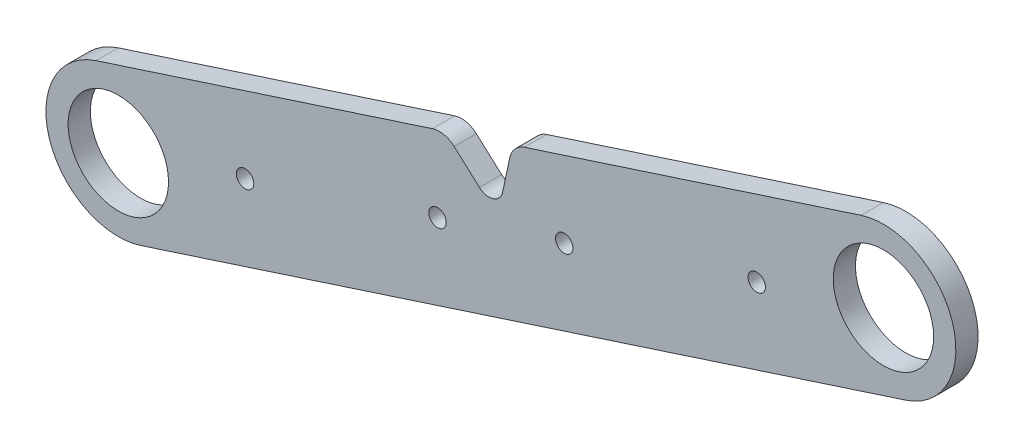
ISO-10303-21;
HEADER;
FILE_DESCRIPTION(('STEP AP214'),'2;1');
FILE_NAME('part.step','',(''),(''),'','','');
FILE_SCHEMA(('AUTOMOTIVE_DESIGN { 1 0 10303 214 1 1 1 1 }'));
ENDSEC;
DATA;
#1=APPLICATION_CONTEXT('core data for automotive mechanical design processes');
#2=APPLICATION_PROTOCOL_DEFINITION('international standard','automotive_design',2000,#1);
#3=PRODUCT_CONTEXT('',#1,'mechanical');
#4=PRODUCT('Part','Part','',(#3));
#5=PRODUCT_RELATED_PRODUCT_CATEGORY('part','',(#4));
#6=PRODUCT_DEFINITION_FORMATION('','',#4);
#7=PRODUCT_DEFINITION_CONTEXT('part definition',#1,'design');
#8=PRODUCT_DEFINITION('design','',#6,#7);
#9=PRODUCT_DEFINITION_SHAPE('','',#8);
#10=(LENGTH_UNIT() NAMED_UNIT(*) SI_UNIT(.MILLI.,.METRE.));
#11=(NAMED_UNIT(*) PLANE_ANGLE_UNIT() SI_UNIT($,.RADIAN.));
#12=(NAMED_UNIT(*) SI_UNIT($,.STERADIAN.) SOLID_ANGLE_UNIT());
#13=UNCERTAINTY_MEASURE_WITH_UNIT(LENGTH_MEASURE(1.E-05),#10,'distance_accuracy_value','');
#14=(GEOMETRIC_REPRESENTATION_CONTEXT(3) GLOBAL_UNCERTAINTY_ASSIGNED_CONTEXT((#13)) GLOBAL_UNIT_ASSIGNED_CONTEXT((#10,
#11,#12)) REPRESENTATION_CONTEXT('',''));
#15=CARTESIAN_POINT('',(0.,0.,0.));
#16=DIRECTION('',(0.,0.,1.));
#17=DIRECTION('',(1.,0.,0.));
#18=AXIS2_PLACEMENT_3D('',#15,#16,#17);
#19=CARTESIAN_POINT('',(-248.402370748276,67.7567016355575,3.175));
#20=DIRECTION('',(0.,0.,1.));
#21=DIRECTION('',(1.,0.,0.));
#22=AXIS2_PLACEMENT_3D('',#19,#20,#21);
#23=PLANE('',#22);
#24=CARTESIAN_POINT('',(-318.104446758383,33.4247503047027,3.175));
#25=DIRECTION('',(0.,0.,1.));
#26=DIRECTION('',(1.,0.,0.));
#27=AXIS2_PLACEMENT_3D('',#24,#25,#26);
#28=CIRCLE('',#27,2.48920000000001);
#29=CARTESIAN_POINT('',(-315.615246758383,33.4247503047027,3.175));
#30=VERTEX_POINT('',#29);
#31=EDGE_CURVE('E367',#30,#30,#28,.T.);
#32=ORIENTED_EDGE('',*,*,#31,.F.);
#33=EDGE_LOOP('',(#32));
#34=FACE_BOUND('',#33,.T.);
#35=CARTESIAN_POINT('',(-226.850792762861,63.0748598410703,3.175));
#36=DIRECTION('',(0.,0.,1.));
#37=DIRECTION('',(1.,0.,0.));
#38=AXIS2_PLACEMENT_3D('',#35,#36,#37);
#39=CIRCLE('',#38,2.4892);
#40=CARTESIAN_POINT('',(-224.361592762862,63.0748598410703,3.175));
#41=VERTEX_POINT('',#40);
#42=EDGE_CURVE('E375',#41,#41,#39,.T.);
#43=ORIENTED_EDGE('',*,*,#42,.F.);
#44=EDGE_LOOP('',(#43));
#45=FACE_BOUND('',#44,.T.);
#46=CARTESIAN_POINT('',(-263.086046033707,51.3013123553848,3.175));
#47=DIRECTION('',(0.,0.,1.));
#48=DIRECTION('',(1.,0.,0.));
#49=AXIS2_PLACEMENT_3D('',#46,#47,#48);
#50=CIRCLE('',#49,2.48920000000001);
#51=CARTESIAN_POINT('',(-260.596846033707,51.3013123553848,3.175));
#52=VERTEX_POINT('',#51);
#53=EDGE_CURVE('E384',#52,#52,#50,.T.);
#54=ORIENTED_EDGE('',*,*,#53,.F.);
#55=EDGE_LOOP('',(#54));
#56=FACE_BOUND('',#55,.T.);
#57=CARTESIAN_POINT('',(-171.832392038186,80.9514218917523,3.175));
#58=DIRECTION('',(0.,0.,1.));
#59=DIRECTION('',(1.,0.,0.));
#60=AXIS2_PLACEMENT_3D('',#57,#58,#59);
#61=CIRCLE('',#60,2.4892);
#62=CARTESIAN_POINT('',(-169.343192038186,80.9514218917523,3.175));
#63=VERTEX_POINT('',#62);
#64=EDGE_CURVE('E368',#63,#63,#61,.T.);
#65=ORIENTED_EDGE('',*,*,#64,.F.);
#66=EDGE_LOOP('',(#65));
#67=FACE_BOUND('',#66,.T.);
#68=CARTESIAN_POINT('',(-135.59713876734,92.7249693774379,3.175));
#69=DIRECTION('',(0.,0.,1.));
#70=DIRECTION('',(1.,0.,0.));
#71=AXIS2_PLACEMENT_3D('',#68,#69,#70);
#72=CIRCLE('',#71,14.3510000000001);
#73=CARTESIAN_POINT('',(-121.24613876734,92.7249693774379,3.175));
#74=VERTEX_POINT('',#73);
#75=EDGE_CURVE('E217',#74,#74,#72,.T.);
#76=ORIENTED_EDGE('',*,*,#75,.F.);
#77=EDGE_LOOP('',(#76));
#78=FACE_BOUND('',#77,.T.);
#79=DIRECTION('',(-0.951056516295153,-0.309016994374948,0.));
#80=VECTOR('',#79,1.);
#81=CARTESIAN_POINT('',(-241.679219613314,80.0231313971656,3.175));
#82=LINE('',#81,#80);
#83=CARTESIAN_POINT('',(-141.994099567896,112.412790321264,3.175));
#84=VERTEX_POINT('',#83);
#85=CARTESIAN_POINT('',(-238.192480741635,81.1560415321952,3.175));
#86=VERTEX_POINT('',#85);
#87=EDGE_CURVE('E210',#84,#86,#82,.T.);
#88=ORIENTED_EDGE('',*,*,#87,.T.);
#89=CARTESIAN_POINT('',(-236.230222827354,75.1168326537209,3.175));
#90=DIRECTION('',(0.,0.,1.));
#91=DIRECTION('',(1.,0.,0.));
#92=AXIS2_PLACEMENT_3D('',#89,#90,#91);
#93=CIRCLE('',#92,6.35);
#94=CARTESIAN_POINT('',(-242.441460092014,76.4370718904137,3.175));
#95=VERTEX_POINT('',#94);
#96=EDGE_CURVE('E154',#86,#95,#93,.T.);
#97=ORIENTED_EDGE('',*,*,#96,.T.);
#98=DIRECTION('',(-0.207911690817758,-0.978147600733806,0.));
#99=VECTOR('',#98,1.);
#100=CARTESIAN_POINT('',(-244.464446322482,66.9196699594943,3.175));
#101=LINE('',#100,#99);
#102=CARTESIAN_POINT('',(-244.464446322482,66.9196699594943,3.175));
#103=VERTEX_POINT('',#102);
#104=EDGE_CURVE('E128',#95,#103,#101,.T.);
#105=ORIENTED_EDGE('',*,*,#104,.T.);
#106=CARTESIAN_POINT('',(-248.402370748276,67.7567016355575,3.175));
#107=DIRECTION('',(0.,0.,-1.));
#108=DIRECTION('',(1.,0.,0.));
#109=AXIS2_PLACEMENT_3D('',#106,#107,#108);
#110=CIRCLE('',#109,4.02589999999997);
#111=CARTESIAN_POINT('',(-251.096223656416,64.7648748826681,3.175));
#112=VERTEX_POINT('',#111);
#113=EDGE_CURVE('E122',#103,#112,#110,.T.);
#114=ORIENTED_EDGE('',*,*,#113,.T.);
#115=DIRECTION('',(-0.743144825477399,0.669130606358853,0.));
#116=VECTOR('',#115,1.);
#117=CARTESIAN_POINT('',(-251.096223656416,64.7648748826681,3.175));
#118=LINE('',#117,#116);
#119=CARTESIAN_POINT('',(-258.327042391385,71.2755333152191,3.175));
#120=VERTEX_POINT('',#119);
#121=EDGE_CURVE('E115',#112,#120,#118,.T.);
#122=ORIENTED_EDGE('',*,*,#121,.T.);
#123=CARTESIAN_POINT('',(-262.576021741764,66.5565636734376,3.175));
#124=DIRECTION('',(0.,0.,1.));
#125=DIRECTION('',(1.,0.,0.));
#126=AXIS2_PLACEMENT_3D('',#123,#124,#125);
#127=CIRCLE('',#126,6.35);
#128=CARTESIAN_POINT('',(-264.538279656045,72.5957725519118,3.175));
#129=VERTEX_POINT('',#128);
#130=EDGE_CURVE('E56',#120,#129,#127,.T.);
#131=ORIENTED_EDGE('',*,*,#130,.T.);
#132=DIRECTION('',(-0.951056516295153,-0.309016994374948,0.));
#133=VECTOR('',#132,1.);
#134=CARTESIAN_POINT('',(-360.736660829784,41.3390237628432,3.175));
#135=LINE('',#134,#133);
#136=CARTESIAN_POINT('',(-360.736660829784,41.3390237628432,3.175));
#137=VERTEX_POINT('',#136);
#138=EDGE_CURVE('E121',#129,#137,#135,.T.);
#139=ORIENTED_EDGE('',*,*,#138,.T.);
#140=CARTESIAN_POINT('',(-354.339700029228,21.6512028190172,3.175));
#141=DIRECTION('',(0.,0.,1.));
#142=DIRECTION('',(1.,0.,0.));
#143=AXIS2_PLACEMENT_3D('',#140,#141,#142);
#144=CIRCLE('',#143,20.701);
#145=CARTESIAN_POINT('',(-347.942739228672,1.96338187519125,3.175));
#146=VERTEX_POINT('',#145);
#147=EDGE_CURVE('E231',#137,#146,#144,.T.);
#148=ORIENTED_EDGE('',*,*,#147,.T.);
#149=DIRECTION('',(0.951056516295153,0.309016994374948,0.));
#150=VECTOR('',#149,1.);
#151=CARTESIAN_POINT('',(-347.942739228672,1.96338187519125,3.175));
#152=LINE('',#151,#150);
#153=CARTESIAN_POINT('',(-129.200177966785,73.0371484336119,3.175));
#154=VERTEX_POINT('',#153);
#155=EDGE_CURVE('E197',#146,#154,#152,.T.);
#156=ORIENTED_EDGE('',*,*,#155,.T.);
#157=CARTESIAN_POINT('',(-135.59713876734,92.7249693774379,3.175));
#158=DIRECTION('',(0.,0.,1.));
#159=DIRECTION('',(1.,0.,0.));
#160=AXIS2_PLACEMENT_3D('',#157,#158,#159);
#161=CIRCLE('',#160,20.701);
#162=EDGE_CURVE('E212',#154,#84,#161,.T.);
#163=ORIENTED_EDGE('',*,*,#162,.T.);
#164=EDGE_LOOP('',(#88,#97,#105,#114,#122,#131,#139,#148,#156,#163));
#165=FACE_BOUND('',#164,.T.);
#166=CARTESIAN_POINT('',(-354.339700029228,21.6512028190172,3.175));
#167=DIRECTION('',(0.,0.,1.));
#168=DIRECTION('',(1.,0.,0.));
#169=AXIS2_PLACEMENT_3D('',#166,#167,#168);
#170=CIRCLE('',#169,14.3510000000001);
#171=CARTESIAN_POINT('',(-339.988700029228,21.6512028190172,3.175));
#172=VERTEX_POINT('',#171);
#173=EDGE_CURVE('E224',#172,#172,#170,.T.);
#174=ORIENTED_EDGE('',*,*,#173,.F.);
#175=EDGE_LOOP('',(#174));
#176=FACE_BOUND('',#175,.T.);
#177=ADVANCED_FACE('F41',(#34,#45,#56,#67,#78,#165,#176),#23,.T.);
#178=CARTESIAN_POINT('',(-248.402370748276,67.7567016355575,-3.175));
#179=DIRECTION('',(0.,0.,1.));
#180=DIRECTION('',(1.,0.,0.));
#181=AXIS2_PLACEMENT_3D('',#178,#179,#180);
#182=PLANE('',#181);
#183=CARTESIAN_POINT('',(-318.104446758383,33.4247503047027,-3.175));
#184=DIRECTION('',(0.,0.,1.));
#185=DIRECTION('',(1.,0.,0.));
#186=AXIS2_PLACEMENT_3D('',#183,#184,#185);
#187=CIRCLE('',#186,2.48920000000001);
#188=CARTESIAN_POINT('',(-315.615246758383,33.4247503047027,-3.175));
#189=VERTEX_POINT('',#188);
#190=EDGE_CURVE('E365',#189,#189,#187,.T.);
#191=ORIENTED_EDGE('',*,*,#190,.T.);
#192=EDGE_LOOP('',(#191));
#193=FACE_BOUND('',#192,.T.);
#194=CARTESIAN_POINT('',(-226.850792762861,63.0748598410703,-3.175));
#195=DIRECTION('',(0.,0.,1.));
#196=DIRECTION('',(1.,0.,0.));
#197=AXIS2_PLACEMENT_3D('',#194,#195,#196);
#198=CIRCLE('',#197,2.4892);
#199=CARTESIAN_POINT('',(-224.361592762862,63.0748598410703,-3.175));
#200=VERTEX_POINT('',#199);
#201=EDGE_CURVE('E379',#200,#200,#198,.T.);
#202=ORIENTED_EDGE('',*,*,#201,.T.);
#203=EDGE_LOOP('',(#202));
#204=FACE_BOUND('',#203,.T.);
#205=CARTESIAN_POINT('',(-263.086046033707,51.3013123553848,-3.175));
#206=DIRECTION('',(0.,0.,1.));
#207=DIRECTION('',(1.,0.,0.));
#208=AXIS2_PLACEMENT_3D('',#205,#206,#207);
#209=CIRCLE('',#208,2.48920000000001);
#210=CARTESIAN_POINT('',(-260.596846033707,51.3013123553848,-3.175));
#211=VERTEX_POINT('',#210);
#212=EDGE_CURVE('E378',#211,#211,#209,.T.);
#213=ORIENTED_EDGE('',*,*,#212,.T.);
#214=EDGE_LOOP('',(#213));
#215=FACE_BOUND('',#214,.T.);
#216=CARTESIAN_POINT('',(-171.832392038186,80.9514218917523,-3.175));
#217=DIRECTION('',(0.,0.,1.));
#218=DIRECTION('',(1.,0.,0.));
#219=AXIS2_PLACEMENT_3D('',#216,#217,#218);
#220=CIRCLE('',#219,2.4892);
#221=CARTESIAN_POINT('',(-169.343192038186,80.9514218917523,-3.175));
#222=VERTEX_POINT('',#221);
#223=EDGE_CURVE('E372',#222,#222,#220,.T.);
#224=ORIENTED_EDGE('',*,*,#223,.T.);
#225=EDGE_LOOP('',(#224));
#226=FACE_BOUND('',#225,.T.);
#227=DIRECTION('',(-0.207911690817758,-0.978147600733806,0.));
#228=VECTOR('',#227,1.);
#229=CARTESIAN_POINT('',(-244.464446322482,66.9196699594943,-3.175));
#230=LINE('',#229,#228);
#231=CARTESIAN_POINT('',(-242.441460092014,76.4370718904137,-3.175));
#232=VERTEX_POINT('',#231);
#233=CARTESIAN_POINT('',(-244.464446322482,66.9196699594943,-3.175));
#234=VERTEX_POINT('',#233);
#235=EDGE_CURVE('E132',#232,#234,#230,.T.);
#236=ORIENTED_EDGE('',*,*,#235,.F.);
#237=CARTESIAN_POINT('',(-236.230222827354,75.1168326537209,-3.175));
#238=DIRECTION('',(0.,0.,1.));
#239=DIRECTION('',(1.,0.,0.));
#240=AXIS2_PLACEMENT_3D('',#237,#238,#239);
#241=CIRCLE('',#240,6.35);
#242=CARTESIAN_POINT('',(-238.192480741635,81.1560415321952,-3.175));
#243=VERTEX_POINT('',#242);
#244=EDGE_CURVE('E149',#232,#243,#241,.F.);
#245=ORIENTED_EDGE('',*,*,#244,.T.);
#246=DIRECTION('',(-0.951056516295153,-0.309016994374948,0.));
#247=VECTOR('',#246,1.);
#248=CARTESIAN_POINT('',(-241.679219613314,80.0231313971656,-3.175));
#249=LINE('',#248,#247);
#250=CARTESIAN_POINT('',(-141.994099567896,112.412790321264,-3.175));
#251=VERTEX_POINT('',#250);
#252=EDGE_CURVE('E180',#251,#243,#249,.T.);
#253=ORIENTED_EDGE('',*,*,#252,.F.);
#254=CARTESIAN_POINT('',(-135.59713876734,92.7249693774379,-3.175));
#255=DIRECTION('',(0.,0.,1.));
#256=DIRECTION('',(1.,0.,0.));
#257=AXIS2_PLACEMENT_3D('',#254,#255,#256);
#258=CIRCLE('',#257,20.701);
#259=CARTESIAN_POINT('',(-129.200177966785,73.0371484336119,-3.175));
#260=VERTEX_POINT('',#259);
#261=EDGE_CURVE('E178',#260,#251,#258,.T.);
#262=ORIENTED_EDGE('',*,*,#261,.F.);
#263=DIRECTION('',(0.951056516295153,0.309016994374948,0.));
#264=VECTOR('',#263,1.);
#265=CARTESIAN_POINT('',(-347.942739228672,1.96338187519125,-3.175));
#266=LINE('',#265,#264);
#267=CARTESIAN_POINT('',(-347.942739228672,1.96338187519125,-3.175));
#268=VERTEX_POINT('',#267);
#269=EDGE_CURVE('E172',#268,#260,#266,.T.);
#270=ORIENTED_EDGE('',*,*,#269,.F.);
#271=CARTESIAN_POINT('',(-354.339700029228,21.6512028190172,-3.175));
#272=DIRECTION('',(0.,0.,1.));
#273=DIRECTION('',(1.,0.,0.));
#274=AXIS2_PLACEMENT_3D('',#271,#272,#273);
#275=CIRCLE('',#274,20.701);
#276=CARTESIAN_POINT('',(-360.736660829784,41.3390237628432,-3.175));
#277=VERTEX_POINT('',#276);
#278=EDGE_CURVE('E169',#277,#268,#275,.T.);
#279=ORIENTED_EDGE('',*,*,#278,.F.);
#280=DIRECTION('',(-0.951056516295153,-0.309016994374948,0.));
#281=VECTOR('',#280,1.);
#282=CARTESIAN_POINT('',(-360.736660829784,41.3390237628432,-3.175));
#283=LINE('',#282,#281);
#284=CARTESIAN_POINT('',(-264.538279656045,72.5957725519118,-3.175));
#285=VERTEX_POINT('',#284);
#286=EDGE_CURVE('E161',#285,#277,#283,.T.);
#287=ORIENTED_EDGE('',*,*,#286,.F.);
#288=CARTESIAN_POINT('',(-262.576021741764,66.5565636734376,-3.175));
#289=DIRECTION('',(0.,0.,1.));
#290=DIRECTION('',(1.,0.,0.));
#291=AXIS2_PLACEMENT_3D('',#288,#289,#290);
#292=CIRCLE('',#291,6.35);
#293=CARTESIAN_POINT('',(-258.327042391385,71.2755333152191,-3.175));
#294=VERTEX_POINT('',#293);
#295=EDGE_CURVE('E141',#285,#294,#292,.F.);
#296=ORIENTED_EDGE('',*,*,#295,.T.);
#297=DIRECTION('',(-0.743144825477399,0.669130606358853,0.));
#298=VECTOR('',#297,1.);
#299=CARTESIAN_POINT('',(-251.096223656416,64.7648748826681,-3.175));
#300=LINE('',#299,#298);
#301=CARTESIAN_POINT('',(-251.096223656416,64.7648748826681,-3.175));
#302=VERTEX_POINT('',#301);
#303=EDGE_CURVE('E170',#302,#294,#300,.T.);
#304=ORIENTED_EDGE('',*,*,#303,.F.);
#305=CARTESIAN_POINT('',(-248.402370748276,67.7567016355575,-3.175));
#306=DIRECTION('',(0.,0.,-1.));
#307=DIRECTION('',(1.,0.,0.));
#308=AXIS2_PLACEMENT_3D('',#305,#306,#307);
#309=CIRCLE('',#308,4.02589999999997);
#310=EDGE_CURVE('E136',#234,#302,#309,.T.);
#311=ORIENTED_EDGE('',*,*,#310,.F.);
#312=EDGE_LOOP('',(#236,#245,#253,#262,#270,#279,#287,#296,#304,#311));
#313=FACE_BOUND('',#312,.T.);
#314=CARTESIAN_POINT('',(-135.59713876734,92.7249693774379,-3.175));
#315=DIRECTION('',(0.,0.,1.));
#316=DIRECTION('',(1.,0.,0.));
#317=AXIS2_PLACEMENT_3D('',#314,#315,#316);
#318=CIRCLE('',#317,14.3510000000001);
#319=CARTESIAN_POINT('',(-121.24613876734,92.7249693774379,-3.175));
#320=VERTEX_POINT('',#319);
#321=EDGE_CURVE('E219',#320,#320,#318,.T.);
#322=ORIENTED_EDGE('',*,*,#321,.T.);
#323=EDGE_LOOP('',(#322));
#324=FACE_BOUND('',#323,.T.);
#325=CARTESIAN_POINT('',(-354.339700029228,21.6512028190172,-3.175));
#326=DIRECTION('',(0.,0.,1.));
#327=DIRECTION('',(1.,0.,0.));
#328=AXIS2_PLACEMENT_3D('',#325,#326,#327);
#329=CIRCLE('',#328,14.3510000000001);
#330=CARTESIAN_POINT('',(-339.988700029228,21.6512028190172,-3.175));
#331=VERTEX_POINT('',#330);
#332=EDGE_CURVE('E227',#331,#331,#329,.T.);
#333=ORIENTED_EDGE('',*,*,#332,.T.);
#334=EDGE_LOOP('',(#333));
#335=FACE_BOUND('',#334,.T.);
#336=ADVANCED_FACE('F166',(#193,#204,#215,#226,#313,#324,#335),#182,.F.);
#337=CARTESIAN_POINT('',(-248.402370748276,67.7567016355575,3.175));
#338=DIRECTION('',(0.,0.,-1.));
#339=DIRECTION('',(-1.,0.,0.));
#340=AXIS2_PLACEMENT_3D('',#337,#338,#339);
#341=CYLINDRICAL_SURFACE('',#340,4.02589999999997);
#342=ORIENTED_EDGE('',*,*,#310,.T.);
#343=DIRECTION('',(0.,0.,-1.));
#344=VECTOR('',#343,1.);
#345=CARTESIAN_POINT('',(-251.096223656416,64.7648748826681,3.175));
#346=LINE('',#345,#344);
#347=EDGE_CURVE('E119',#112,#302,#346,.T.);
#348=ORIENTED_EDGE('',*,*,#347,.F.);
#349=ORIENTED_EDGE('',*,*,#113,.F.);
#350=DIRECTION('',(0.,0.,-1.));
#351=VECTOR('',#350,1.);
#352=CARTESIAN_POINT('',(-244.464446322482,66.9196699594943,3.175));
#353=LINE('',#352,#351);
#354=EDGE_CURVE('E184',#103,#234,#353,.T.);
#355=ORIENTED_EDGE('',*,*,#354,.T.);
#356=EDGE_LOOP('',(#342,#348,#349,#355));
#357=FACE_BOUND('',#356,.T.);
#358=ADVANCED_FACE('F134',(#357),#341,.F.);
#359=CARTESIAN_POINT('',(-251.096223656416,64.7648748826681,3.175));
#360=DIRECTION('',(-0.669130606358853,-0.743144825477399,0.));
#361=DIRECTION('',(0.743144825477399,-0.669130606358853,0.));
#362=AXIS2_PLACEMENT_3D('',#359,#360,#361);
#363=PLANE('',#362);
#364=ORIENTED_EDGE('',*,*,#303,.T.);
#365=DIRECTION('',(0.,0.,-1.));
#366=VECTOR('',#365,1.);
#367=CARTESIAN_POINT('',(-258.327042391385,71.2755333152191,3.175));
#368=LINE('',#367,#366);
#369=EDGE_CURVE('E11',#294,#120,#368,.F.);
#370=ORIENTED_EDGE('',*,*,#369,.T.);
#371=ORIENTED_EDGE('',*,*,#121,.F.);
#372=ORIENTED_EDGE('',*,*,#347,.T.);
#373=EDGE_LOOP('',(#364,#370,#371,#372));
#374=FACE_BOUND('',#373,.T.);
#375=ADVANCED_FACE('F117',(#374),#363,.F.);
#376=CARTESIAN_POINT('',(-360.736660829784,41.3390237628432,3.175));
#377=DIRECTION('',(0.309016994374948,-0.951056516295153,0.));
#378=DIRECTION('',(0.951056516295153,0.309016994374948,0.));
#379=AXIS2_PLACEMENT_3D('',#376,#377,#378);
#380=PLANE('',#379);
#381=ORIENTED_EDGE('',*,*,#138,.F.);
#382=DIRECTION('',(0.,0.,-1.));
#383=VECTOR('',#382,1.);
#384=CARTESIAN_POINT('',(-264.538279656045,72.5957725519118,3.175));
#385=LINE('',#384,#383);
#386=EDGE_CURVE('E49',#129,#285,#385,.T.);
#387=ORIENTED_EDGE('',*,*,#386,.T.);
#388=ORIENTED_EDGE('',*,*,#286,.T.);
#389=DIRECTION('',(0.,0.,-1.));
#390=VECTOR('',#389,1.);
#391=CARTESIAN_POINT('',(-360.736660829784,41.3390237628432,3.175));
#392=LINE('',#391,#390);
#393=EDGE_CURVE('E138',#137,#277,#392,.T.);
#394=ORIENTED_EDGE('',*,*,#393,.F.);
#395=EDGE_LOOP('',(#381,#387,#388,#394));
#396=FACE_BOUND('',#395,.T.);
#397=ADVANCED_FACE('F159',(#396),#380,.F.);
#398=CARTESIAN_POINT('',(-354.339700029228,21.6512028190172,3.175));
#399=DIRECTION('',(0.,0.,-1.));
#400=DIRECTION('',(-1.,0.,0.));
#401=AXIS2_PLACEMENT_3D('',#398,#399,#400);
#402=CYLINDRICAL_SURFACE('',#401,20.701);
#403=ORIENTED_EDGE('',*,*,#278,.T.);
#404=DIRECTION('',(0.,0.,-1.));
#405=VECTOR('',#404,1.);
#406=CARTESIAN_POINT('',(-347.942739228672,1.96338187519125,3.175));
#407=LINE('',#406,#405);
#408=EDGE_CURVE('E144',#146,#268,#407,.T.);
#409=ORIENTED_EDGE('',*,*,#408,.F.);
#410=ORIENTED_EDGE('',*,*,#147,.F.);
#411=ORIENTED_EDGE('',*,*,#393,.T.);
#412=EDGE_LOOP('',(#403,#409,#410,#411));
#413=FACE_BOUND('',#412,.T.);
#414=ADVANCED_FACE('F232',(#413),#402,.T.);
#415=CARTESIAN_POINT('',(-347.942739228672,1.96338187519125,3.175));
#416=DIRECTION('',(-0.309016994374948,0.951056516295153,0.));
#417=DIRECTION('',(-0.951056516295153,-0.309016994374948,0.));
#418=AXIS2_PLACEMENT_3D('',#415,#416,#417);
#419=PLANE('',#418);
#420=ORIENTED_EDGE('',*,*,#269,.T.);
#421=DIRECTION('',(0.,0.,-1.));
#422=VECTOR('',#421,1.);
#423=CARTESIAN_POINT('',(-129.200177966785,73.0371484336119,3.175));
#424=LINE('',#423,#422);
#425=EDGE_CURVE('E189',#154,#260,#424,.T.);
#426=ORIENTED_EDGE('',*,*,#425,.F.);
#427=ORIENTED_EDGE('',*,*,#155,.F.);
#428=ORIENTED_EDGE('',*,*,#408,.T.);
#429=EDGE_LOOP('',(#420,#426,#427,#428));
#430=FACE_BOUND('',#429,.T.);
#431=ADVANCED_FACE('F195',(#430),#419,.F.);
#432=CARTESIAN_POINT('',(-135.59713876734,92.7249693774379,3.175));
#433=DIRECTION('',(0.,0.,-1.));
#434=DIRECTION('',(-1.,0.,0.));
#435=AXIS2_PLACEMENT_3D('',#432,#433,#434);
#436=CYLINDRICAL_SURFACE('',#435,20.701);
#437=ORIENTED_EDGE('',*,*,#261,.T.);
#438=DIRECTION('',(0.,0.,-1.));
#439=VECTOR('',#438,1.);
#440=CARTESIAN_POINT('',(-141.994099567896,112.412790321264,3.175));
#441=LINE('',#440,#439);
#442=EDGE_CURVE('E186',#84,#251,#441,.T.);
#443=ORIENTED_EDGE('',*,*,#442,.F.);
#444=ORIENTED_EDGE('',*,*,#162,.F.);
#445=ORIENTED_EDGE('',*,*,#425,.T.);
#446=EDGE_LOOP('',(#437,#443,#444,#445));
#447=FACE_BOUND('',#446,.T.);
#448=ADVANCED_FACE('F204',(#447),#436,.T.);
#449=CARTESIAN_POINT('',(-241.679219613314,80.0231313971656,3.175));
#450=DIRECTION('',(0.309016994374948,-0.951056516295153,0.));
#451=DIRECTION('',(0.951056516295153,0.309016994374948,0.));
#452=AXIS2_PLACEMENT_3D('',#449,#450,#451);
#453=PLANE('',#452);
#454=ORIENTED_EDGE('',*,*,#252,.T.);
#455=DIRECTION('',(0.,0.,-1.));
#456=VECTOR('',#455,1.);
#457=CARTESIAN_POINT('',(-238.192480741635,81.1560415321952,3.175));
#458=LINE('',#457,#456);
#459=EDGE_CURVE('E151',#243,#86,#458,.F.);
#460=ORIENTED_EDGE('',*,*,#459,.T.);
#461=ORIENTED_EDGE('',*,*,#87,.F.);
#462=ORIENTED_EDGE('',*,*,#442,.T.);
#463=EDGE_LOOP('',(#454,#460,#461,#462));
#464=FACE_BOUND('',#463,.T.);
#465=ADVANCED_FACE('F208',(#464),#453,.F.);
#466=CARTESIAN_POINT('',(-244.464446322482,66.9196699594943,3.175));
#467=DIRECTION('',(0.978147600733806,-0.207911690817758,0.));
#468=DIRECTION('',(0.207911690817758,0.978147600733806,0.));
#469=AXIS2_PLACEMENT_3D('',#466,#467,#468);
#470=PLANE('',#469);
#471=ORIENTED_EDGE('',*,*,#104,.F.);
#472=DIRECTION('',(0.,0.,-1.));
#473=VECTOR('',#472,1.);
#474=CARTESIAN_POINT('',(-242.441460092014,76.4370718904137,3.175));
#475=LINE('',#474,#473);
#476=EDGE_CURVE('E137',#95,#232,#475,.T.);
#477=ORIENTED_EDGE('',*,*,#476,.T.);
#478=ORIENTED_EDGE('',*,*,#235,.T.);
#479=ORIENTED_EDGE('',*,*,#354,.F.);
#480=EDGE_LOOP('',(#471,#477,#478,#479));
#481=FACE_BOUND('',#480,.T.);
#482=ADVANCED_FACE('F257',(#481),#470,.F.);
#483=CARTESIAN_POINT('',(-135.59713876734,92.7249693774379,3.175));
#484=DIRECTION('',(0.,0.,-1.));
#485=DIRECTION('',(-1.,0.,0.));
#486=AXIS2_PLACEMENT_3D('',#483,#484,#485);
#487=CYLINDRICAL_SURFACE('',#486,14.3510000000001);
#488=ORIENTED_EDGE('',*,*,#75,.T.);
#489=EDGE_LOOP('',(#488));
#490=FACE_BOUND('',#489,.T.);
#491=ORIENTED_EDGE('',*,*,#321,.F.);
#492=EDGE_LOOP('',(#491));
#493=FACE_BOUND('',#492,.T.);
#494=ADVANCED_FACE('F254',(#490,#493),#487,.F.);
#495=CARTESIAN_POINT('',(-354.339700029228,21.6512028190172,3.175));
#496=DIRECTION('',(0.,0.,-1.));
#497=DIRECTION('',(-1.,0.,0.));
#498=AXIS2_PLACEMENT_3D('',#495,#496,#497);
#499=CYLINDRICAL_SURFACE('',#498,14.3510000000001);
#500=ORIENTED_EDGE('',*,*,#173,.T.);
#501=EDGE_LOOP('',(#500));
#502=FACE_BOUND('',#501,.T.);
#503=ORIENTED_EDGE('',*,*,#332,.F.);
#504=EDGE_LOOP('',(#503));
#505=FACE_BOUND('',#504,.T.);
#506=ADVANCED_FACE('F276',(#502,#505),#499,.F.);
#507=CARTESIAN_POINT('',(-236.230222827354,75.1168326537209,3.175));
#508=DIRECTION('',(0.,0.,-1.));
#509=DIRECTION('',(-1.,0.,0.));
#510=AXIS2_PLACEMENT_3D('',#507,#508,#509);
#511=CYLINDRICAL_SURFACE('',#510,6.35);
#512=ORIENTED_EDGE('',*,*,#96,.F.);
#513=ORIENTED_EDGE('',*,*,#459,.F.);
#514=ORIENTED_EDGE('',*,*,#244,.F.);
#515=ORIENTED_EDGE('',*,*,#476,.F.);
#516=EDGE_LOOP('',(#512,#513,#514,#515));
#517=FACE_BOUND('',#516,.T.);
#518=ADVANCED_FACE('F284',(#517),#511,.T.);
#519=CARTESIAN_POINT('',(-262.576021741764,66.5565636734376,3.175));
#520=DIRECTION('',(0.,0.,-1.));
#521=DIRECTION('',(-1.,0.,0.));
#522=AXIS2_PLACEMENT_3D('',#519,#520,#521);
#523=CYLINDRICAL_SURFACE('',#522,6.35);
#524=ORIENTED_EDGE('',*,*,#130,.F.);
#525=ORIENTED_EDGE('',*,*,#369,.F.);
#526=ORIENTED_EDGE('',*,*,#295,.F.);
#527=ORIENTED_EDGE('',*,*,#386,.F.);
#528=EDGE_LOOP('',(#524,#525,#526,#527));
#529=FACE_BOUND('',#528,.T.);
#530=ADVANCED_FACE('F43',(#529),#523,.T.);
#531=CARTESIAN_POINT('',(-171.832392038186,80.9514218917523,-3.175));
#532=DIRECTION('',(0.,0.,1.));
#533=DIRECTION('',(1.,0.,0.));
#534=AXIS2_PLACEMENT_3D('',#531,#532,#533);
#535=CYLINDRICAL_SURFACE('',#534,2.4892);
#536=ORIENTED_EDGE('',*,*,#223,.F.);
#537=EDGE_LOOP('',(#536));
#538=FACE_BOUND('',#537,.T.);
#539=ORIENTED_EDGE('',*,*,#64,.T.);
#540=EDGE_LOOP('',(#539));
#541=FACE_BOUND('',#540,.T.);
#542=ADVANCED_FACE('F318',(#538,#541),#535,.F.);
#543=CARTESIAN_POINT('',(-263.086046033707,51.3013123553848,-3.175));
#544=DIRECTION('',(0.,0.,1.));
#545=DIRECTION('',(1.,0.,0.));
#546=AXIS2_PLACEMENT_3D('',#543,#544,#545);
#547=CYLINDRICAL_SURFACE('',#546,2.48920000000001);
#548=ORIENTED_EDGE('',*,*,#212,.F.);
#549=EDGE_LOOP('',(#548));
#550=FACE_BOUND('',#549,.T.);
#551=ORIENTED_EDGE('',*,*,#53,.T.);
#552=EDGE_LOOP('',(#551));
#553=FACE_BOUND('',#552,.T.);
#554=ADVANCED_FACE('F329',(#550,#553),#547,.F.);
#555=CARTESIAN_POINT('',(-226.850792762861,63.0748598410703,-3.175));
#556=DIRECTION('',(0.,0.,1.));
#557=DIRECTION('',(1.,0.,0.));
#558=AXIS2_PLACEMENT_3D('',#555,#556,#557);
#559=CYLINDRICAL_SURFACE('',#558,2.4892);
#560=ORIENTED_EDGE('',*,*,#201,.F.);
#561=EDGE_LOOP('',(#560));
#562=FACE_BOUND('',#561,.T.);
#563=ORIENTED_EDGE('',*,*,#42,.T.);
#564=EDGE_LOOP('',(#563));
#565=FACE_BOUND('',#564,.T.);
#566=ADVANCED_FACE('F339',(#562,#565),#559,.F.);
#567=CARTESIAN_POINT('',(-318.104446758383,33.4247503047027,-3.175));
#568=DIRECTION('',(0.,0.,1.));
#569=DIRECTION('',(1.,0.,0.));
#570=AXIS2_PLACEMENT_3D('',#567,#568,#569);
#571=CYLINDRICAL_SURFACE('',#570,2.48920000000001);
#572=ORIENTED_EDGE('',*,*,#190,.F.);
#573=EDGE_LOOP('',(#572));
#574=FACE_BOUND('',#573,.T.);
#575=ORIENTED_EDGE('',*,*,#31,.T.);
#576=EDGE_LOOP('',(#575));
#577=FACE_BOUND('',#576,.T.);
#578=ADVANCED_FACE('F349',(#574,#577),#571,.F.);
#579=CLOSED_SHELL('',(#177,#336,#358,#375,#397,#414,#431,#448,#465,#482,#494,#506,#518,#530,
#542,#554,#566,#578));
#580=MANIFOLD_SOLID_BREP('B2',#579);
#581=ADVANCED_BREP_SHAPE_REPRESENTATION('',(#18,#580),#14);
#582=SHAPE_DEFINITION_REPRESENTATION(#9,#581);
ENDSEC;
END-ISO-10303-21;
